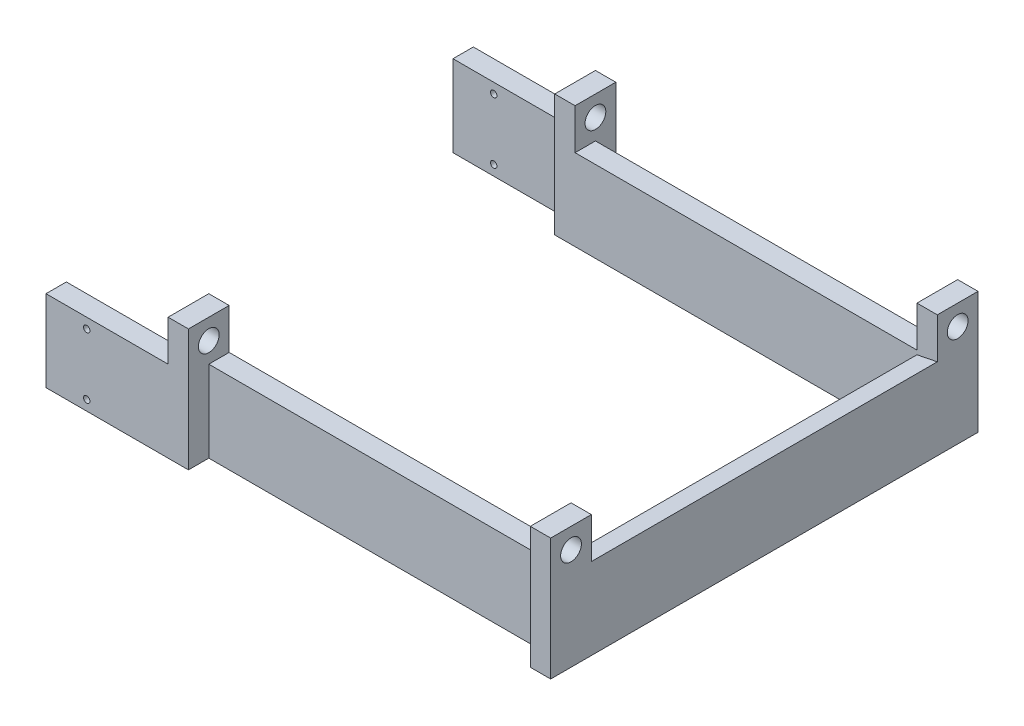
ISO-10303-21;
HEADER;
FILE_DESCRIPTION(('STEP AP214'),'2;1');
FILE_NAME('part.step','',(''),(''),'','','');
FILE_SCHEMA(('AUTOMOTIVE_DESIGN { 1 0 10303 214 1 1 1 1 }'));
ENDSEC;
DATA;
#1=APPLICATION_CONTEXT('core data for automotive mechanical design processes');
#2=APPLICATION_PROTOCOL_DEFINITION('international standard','automotive_design',2000,#1);
#3=PRODUCT_CONTEXT('',#1,'mechanical');
#4=PRODUCT('Part','Part','',(#3));
#5=PRODUCT_RELATED_PRODUCT_CATEGORY('part','',(#4));
#6=PRODUCT_DEFINITION_FORMATION('','',#4);
#7=PRODUCT_DEFINITION_CONTEXT('part definition',#1,'design');
#8=PRODUCT_DEFINITION('design','',#6,#7);
#9=PRODUCT_DEFINITION_SHAPE('','',#8);
#10=(LENGTH_UNIT() NAMED_UNIT(*) SI_UNIT(.MILLI.,.METRE.));
#11=(NAMED_UNIT(*) PLANE_ANGLE_UNIT() SI_UNIT($,.RADIAN.));
#12=(NAMED_UNIT(*) SI_UNIT($,.STERADIAN.) SOLID_ANGLE_UNIT());
#13=UNCERTAINTY_MEASURE_WITH_UNIT(LENGTH_MEASURE(1.E-05),#10,'distance_accuracy_value','');
#14=(GEOMETRIC_REPRESENTATION_CONTEXT(3) GLOBAL_UNCERTAINTY_ASSIGNED_CONTEXT((#13)) GLOBAL_UNIT_ASSIGNED_CONTEXT((#10,
#11,#12)) REPRESENTATION_CONTEXT('',''));
#15=CARTESIAN_POINT('',(0.,0.,0.));
#16=DIRECTION('',(0.,0.,1.));
#17=DIRECTION('',(1.,0.,0.));
#18=AXIS2_PLACEMENT_3D('',#15,#16,#17);
#19=CARTESIAN_POINT('',(0.,25.4,0.));
#20=DIRECTION('',(0.,1.,0.));
#21=DIRECTION('',(0.,0.,1.));
#22=AXIS2_PLACEMENT_3D('',#19,#20,#21);
#23=PLANE('',#22);
#24=DIRECTION('',(1.,0.,0.));
#25=VECTOR('',#24,1.);
#26=CARTESIAN_POINT('',(3.17499999999997,25.4,-114.3));
#27=LINE('',#26,#25);
#28=CARTESIAN_POINT('',(6.35,25.4,-114.3));
#29=VERTEX_POINT('',#28);
#30=CARTESIAN_POINT('',(113.03,25.4,-114.3));
#31=VERTEX_POINT('',#30);
#32=EDGE_CURVE('E68',#29,#31,#27,.T.);
#33=ORIENTED_EDGE('',*,*,#32,.T.);
#34=DIRECTION('',(0.,0.,-1.));
#35=VECTOR('',#34,1.);
#36=CARTESIAN_POINT('',(113.03,25.4,0.));
#37=LINE('',#36,#35);
#38=CARTESIAN_POINT('',(113.03,25.4,-120.65));
#39=VERTEX_POINT('',#38);
#40=EDGE_CURVE('E63',#31,#39,#37,.T.);
#41=ORIENTED_EDGE('',*,*,#40,.T.);
#42=DIRECTION('',(-1.,0.,0.));
#43=VECTOR('',#42,1.);
#44=CARTESIAN_POINT('',(0.,25.4,-120.65));
#45=LINE('',#44,#43);
#46=CARTESIAN_POINT('',(6.35,25.4,-120.65));
#47=VERTEX_POINT('',#46);
#48=EDGE_CURVE('E473',#39,#47,#45,.T.);
#49=ORIENTED_EDGE('',*,*,#48,.T.);
#50=DIRECTION('',(0.,0.,1.));
#51=VECTOR('',#50,1.);
#52=CARTESIAN_POINT('',(6.34999999999961,25.4,0.));
#53=LINE('',#52,#51);
#54=EDGE_CURVE('E332',#47,#29,#53,.T.);
#55=ORIENTED_EDGE('',*,*,#54,.T.);
#56=EDGE_LOOP('',(#33,#41,#49,#55));
#57=FACE_BOUND('',#56,.T.);
#58=ADVANCED_FACE('F45',(#57),#23,.T.);
#59=CARTESIAN_POINT('',(0.,25.4,-120.65));
#60=DIRECTION('',(0.,0.,1.));
#61=DIRECTION('',(1.,0.,0.));
#62=AXIS2_PLACEMENT_3D('',#59,#60,#61);
#63=PLANE('',#62);
#64=DIRECTION('',(0.,1.,0.));
#65=VECTOR('',#64,1.);
#66=CARTESIAN_POINT('',(113.03,25.4,-120.65));
#67=LINE('',#66,#65);
#68=CARTESIAN_POINT('',(113.03,0.,-120.65));
#69=VERTEX_POINT('',#68);
#70=EDGE_CURVE('E242',#69,#39,#67,.T.);
#71=ORIENTED_EDGE('',*,*,#70,.F.);
#72=DIRECTION('',(-1.,0.,0.));
#73=VECTOR('',#72,1.);
#74=CARTESIAN_POINT('',(0.,0.,-120.65));
#75=LINE('',#74,#73);
#76=CARTESIAN_POINT('',(6.35,0.,-120.65));
#77=VERTEX_POINT('',#76);
#78=EDGE_CURVE('E256',#69,#77,#75,.T.);
#79=ORIENTED_EDGE('',*,*,#78,.T.);
#80=DIRECTION('',(0.,1.,0.));
#81=VECTOR('',#80,1.);
#82=CARTESIAN_POINT('',(6.35,25.4,-120.65));
#83=LINE('',#82,#81);
#84=EDGE_CURVE('E398',#77,#47,#83,.T.);
#85=ORIENTED_EDGE('',*,*,#84,.T.);
#86=ORIENTED_EDGE('',*,*,#48,.F.);
#87=EDGE_LOOP('',(#71,#79,#85,#86));
#88=FACE_BOUND('',#87,.T.);
#89=ADVANCED_FACE('F642',(#88),#63,.F.);
#90=DIRECTION('',(-1.,0.,0.));
#91=VECTOR('',#90,1.);
#92=CARTESIAN_POINT('',(6.35,25.4,6.35));
#93=LINE('',#92,#91);
#94=CARTESIAN_POINT('',(0.,25.4,6.35));
#95=VERTEX_POINT('',#94);
#96=CARTESIAN_POINT('',(-38.1,25.4,6.35));
#97=VERTEX_POINT('',#96);
#98=EDGE_CURVE('E420',#95,#97,#93,.T.);
#99=ORIENTED_EDGE('',*,*,#98,.F.);
#100=DIRECTION('',(0.,0.,-1.));
#101=VECTOR('',#100,1.);
#102=CARTESIAN_POINT('',(0.,25.4,0.));
#103=LINE('',#102,#101);
#104=CARTESIAN_POINT('',(0.,25.4,0.));
#105=VERTEX_POINT('',#104);
#106=EDGE_CURVE('E304',#95,#105,#103,.T.);
#107=ORIENTED_EDGE('',*,*,#106,.T.);
#108=DIRECTION('',(-1.,0.,0.));
#109=VECTOR('',#108,1.);
#110=CARTESIAN_POINT('',(6.35,25.4,0.));
#111=LINE('',#110,#109);
#112=CARTESIAN_POINT('',(-38.1,25.4,0.));
#113=VERTEX_POINT('',#112);
#114=EDGE_CURVE('E434',#105,#113,#111,.T.);
#115=ORIENTED_EDGE('',*,*,#114,.T.);
#116=DIRECTION('',(0.,0.,-1.));
#117=VECTOR('',#116,1.);
#118=CARTESIAN_POINT('',(-38.1,25.4,6.35));
#119=LINE('',#118,#117);
#120=EDGE_CURVE('E450',#97,#113,#119,.T.);
#121=ORIENTED_EDGE('',*,*,#120,.F.);
#122=EDGE_LOOP('',(#99,#107,#115,#121));
#123=FACE_BOUND('',#122,.T.);
#124=ADVANCED_FACE('F644',(#123),#23,.T.);
#125=DIRECTION('',(-1.,0.,0.));
#126=VECTOR('',#125,1.);
#127=CARTESIAN_POINT('',(3.17500000000001,25.4,-6.35));
#128=LINE('',#127,#126);
#129=CARTESIAN_POINT('',(113.03,25.4,-6.35));
#130=VERTEX_POINT('',#129);
#131=CARTESIAN_POINT('',(6.34999999999998,25.4,-6.35));
#132=VERTEX_POINT('',#131);
#133=EDGE_CURVE('E479',#130,#132,#128,.T.);
#134=ORIENTED_EDGE('',*,*,#133,.T.);
#135=DIRECTION('',(0.,0.,1.));
#136=VECTOR('',#135,1.);
#137=CARTESIAN_POINT('',(6.35000000000001,25.4,0.));
#138=LINE('',#137,#136);
#139=CARTESIAN_POINT('',(6.35,25.4,0.));
#140=VERTEX_POINT('',#139);
#141=EDGE_CURVE('E307',#132,#140,#138,.T.);
#142=ORIENTED_EDGE('',*,*,#141,.T.);
#143=DIRECTION('',(1.,0.,0.));
#144=VECTOR('',#143,1.);
#145=CARTESIAN_POINT('',(0.,25.4,0.));
#146=LINE('',#145,#144);
#147=CARTESIAN_POINT('',(113.03,25.4,0.));
#148=VERTEX_POINT('',#147);
#149=EDGE_CURVE('E469',#140,#148,#146,.T.);
#150=ORIENTED_EDGE('',*,*,#149,.T.);
#151=DIRECTION('',(0.,0.,-1.));
#152=VECTOR('',#151,1.);
#153=CARTESIAN_POINT('',(113.03,25.4,0.));
#154=LINE('',#153,#152);
#155=EDGE_CURVE('E373',#148,#130,#154,.T.);
#156=ORIENTED_EDGE('',*,*,#155,.T.);
#157=EDGE_LOOP('',(#134,#142,#150,#156));
#158=FACE_BOUND('',#157,.T.);
#159=ADVANCED_FACE('F612',(#158),#23,.T.);
#160=DIRECTION('',(-1.,0.,0.));
#161=VECTOR('',#160,1.);
#162=CARTESIAN_POINT('',(0.,25.4,-120.65));
#163=LINE('',#162,#161);
#164=CARTESIAN_POINT('',(0.,25.4,-120.65));
#165=VERTEX_POINT('',#164);
#166=CARTESIAN_POINT('',(-38.1,25.4,-120.65));
#167=VERTEX_POINT('',#166);
#168=EDGE_CURVE('E402',#165,#167,#163,.T.);
#169=ORIENTED_EDGE('',*,*,#168,.F.);
#170=DIRECTION('',(0.,0.,-1.));
#171=VECTOR('',#170,1.);
#172=CARTESIAN_POINT('',(-1.16701982748805E-13,25.4,0.));
#173=LINE('',#172,#171);
#174=CARTESIAN_POINT('',(0.,25.4,-127.));
#175=VERTEX_POINT('',#174);
#176=EDGE_CURVE('E335',#165,#175,#173,.T.);
#177=ORIENTED_EDGE('',*,*,#176,.T.);
#178=DIRECTION('',(-1.,0.,0.));
#179=VECTOR('',#178,1.);
#180=CARTESIAN_POINT('',(0.,25.4,-127.));
#181=LINE('',#180,#179);
#182=CARTESIAN_POINT('',(-38.1,25.4,-127.));
#183=VERTEX_POINT('',#182);
#184=EDGE_CURVE('E388',#175,#183,#181,.T.);
#185=ORIENTED_EDGE('',*,*,#184,.T.);
#186=DIRECTION('',(0.,0.,1.));
#187=VECTOR('',#186,1.);
#188=CARTESIAN_POINT('',(-38.1,25.4,-127.));
#189=LINE('',#188,#187);
#190=EDGE_CURVE('E411',#183,#167,#189,.T.);
#191=ORIENTED_EDGE('',*,*,#190,.T.);
#192=EDGE_LOOP('',(#169,#177,#185,#191));
#193=FACE_BOUND('',#192,.T.);
#194=ADVANCED_FACE('F645',(#193),#23,.T.);
#195=CARTESIAN_POINT('',(0.,25.4,0.));
#196=DIRECTION('',(0.,0.,-1.));
#197=DIRECTION('',(-1.,0.,0.));
#198=AXIS2_PLACEMENT_3D('',#195,#196,#197);
#199=PLANE('',#198);
#200=DIRECTION('',(0.,-1.,0.));
#201=VECTOR('',#200,1.);
#202=CARTESIAN_POINT('',(113.03,25.4,0.));
#203=LINE('',#202,#201);
#204=CARTESIAN_POINT('',(113.03,0.,0.));
#205=VERTEX_POINT('',#204);
#206=EDGE_CURVE('E377',#148,#205,#203,.T.);
#207=ORIENTED_EDGE('',*,*,#206,.F.);
#208=ORIENTED_EDGE('',*,*,#149,.F.);
#209=DIRECTION('',(0.,1.,0.));
#210=VECTOR('',#209,1.);
#211=CARTESIAN_POINT('',(6.35,25.4,0.));
#212=LINE('',#211,#210);
#213=CARTESIAN_POINT('',(6.35,0.,0.));
#214=VERTEX_POINT('',#213);
#215=EDGE_CURVE('E410',#214,#140,#212,.T.);
#216=ORIENTED_EDGE('',*,*,#215,.F.);
#217=DIRECTION('',(1.,0.,0.));
#218=VECTOR('',#217,1.);
#219=CARTESIAN_POINT('',(0.,0.,0.));
#220=LINE('',#219,#218);
#221=EDGE_CURVE('E485',#214,#205,#220,.T.);
#222=ORIENTED_EDGE('',*,*,#221,.T.);
#223=EDGE_LOOP('',(#207,#208,#216,#222));
#224=FACE_BOUND('',#223,.T.);
#225=ADVANCED_FACE('F615',(#224),#199,.F.);
#226=CARTESIAN_POINT('',(0.,25.4,0.));
#227=DIRECTION('',(1.,0.,0.));
#228=DIRECTION('',(0.,0.,-1.));
#229=AXIS2_PLACEMENT_3D('',#226,#227,#228);
#230=PLANE('',#229);
#231=CARTESIAN_POINT('',(0.,31.75,0.));
#232=DIRECTION('',(1.,0.,0.));
#233=DIRECTION('',(0.,0.,-1.));
#234=AXIS2_PLACEMENT_3D('',#231,#232,#233);
#235=CIRCLE('',#234,3.2385);
#236=CARTESIAN_POINT('',(0.,31.75,-3.23849999999999));
#237=VERTEX_POINT('',#236);
#238=EDGE_CURVE('E562',#237,#237,#235,.T.);
#239=ORIENTED_EDGE('',*,*,#238,.T.);
#240=EDGE_LOOP('',(#239));
#241=FACE_BOUND('',#240,.T.);
#242=DIRECTION('',(0.,0.,1.));
#243=VECTOR('',#242,1.);
#244=CARTESIAN_POINT('',(0.,0.,0.));
#245=LINE('',#244,#243);
#246=CARTESIAN_POINT('',(0.,0.,-6.35));
#247=VERTEX_POINT('',#246);
#248=CARTESIAN_POINT('',(0.,0.,0.));
#249=VERTEX_POINT('',#248);
#250=EDGE_CURVE('E468',#247,#249,#245,.T.);
#251=ORIENTED_EDGE('',*,*,#250,.T.);
#252=DIRECTION('',(0.,-1.,0.));
#253=VECTOR('',#252,1.);
#254=CARTESIAN_POINT('',(0.,25.4,0.));
#255=LINE('',#254,#253);
#256=EDGE_CURVE('E11',#105,#249,#255,.T.);
#257=ORIENTED_EDGE('',*,*,#256,.F.);
#258=ORIENTED_EDGE('',*,*,#106,.F.);
#259=DIRECTION('',(0.,-1.,0.));
#260=VECTOR('',#259,1.);
#261=CARTESIAN_POINT('',(0.,38.1,6.35000000000002));
#262=LINE('',#261,#260);
#263=CARTESIAN_POINT('',(0.,38.1,6.35000000000002));
#264=VERTEX_POINT('',#263);
#265=EDGE_CURVE('E282',#264,#95,#262,.T.);
#266=ORIENTED_EDGE('',*,*,#265,.F.);
#267=DIRECTION('',(0.,0.,1.));
#268=VECTOR('',#267,1.);
#269=CARTESIAN_POINT('',(0.,38.1,0.));
#270=LINE('',#269,#268);
#271=CARTESIAN_POINT('',(0.,38.1,-6.35));
#272=VERTEX_POINT('',#271);
#273=EDGE_CURVE('E300',#272,#264,#270,.T.);
#274=ORIENTED_EDGE('',*,*,#273,.F.);
#275=DIRECTION('',(0.,-1.,0.));
#276=VECTOR('',#275,1.);
#277=CARTESIAN_POINT('',(0.,25.4,-6.35));
#278=LINE('',#277,#276);
#279=EDGE_CURVE('E482',#272,#247,#278,.T.);
#280=ORIENTED_EDGE('',*,*,#279,.T.);
#281=EDGE_LOOP('',(#251,#257,#258,#266,#274,#280));
#282=FACE_BOUND('',#281,.T.);
#283=ADVANCED_FACE('F47',(#241,#282),#230,.F.);
#284=CARTESIAN_POINT('',(119.38,25.4,0.));
#285=DIRECTION('',(-1.,0.,0.));
#286=DIRECTION('',(0.,0.,1.));
#287=AXIS2_PLACEMENT_3D('',#284,#285,#286);
#288=PLANE('',#287);
#289=CARTESIAN_POINT('',(119.38,31.75,0.));
#290=DIRECTION('',(-1.,0.,0.));
#291=DIRECTION('',(0.,0.,1.));
#292=AXIS2_PLACEMENT_3D('',#289,#290,#291);
#293=CIRCLE('',#292,3.2385);
#294=CARTESIAN_POINT('',(119.38,31.75,3.2385));
#295=VERTEX_POINT('',#294);
#296=EDGE_CURVE('E558',#295,#295,#293,.T.);
#297=ORIENTED_EDGE('',*,*,#296,.T.);
#298=EDGE_LOOP('',(#297));
#299=FACE_BOUND('',#298,.T.);
#300=CARTESIAN_POINT('',(119.38,31.75,-120.65));
#301=DIRECTION('',(-1.,0.,0.));
#302=DIRECTION('',(0.,0.,1.));
#303=AXIS2_PLACEMENT_3D('',#300,#301,#302);
#304=CIRCLE('',#303,3.23850000000001);
#305=CARTESIAN_POINT('',(119.38,31.75,-117.4115));
#306=VERTEX_POINT('',#305);
#307=EDGE_CURVE('E550',#306,#306,#304,.T.);
#308=ORIENTED_EDGE('',*,*,#307,.T.);
#309=EDGE_LOOP('',(#308));
#310=FACE_BOUND('',#309,.T.);
#311=DIRECTION('',(0.,-1.,0.));
#312=VECTOR('',#311,1.);
#313=CARTESIAN_POINT('',(119.38,38.1,-114.3));
#314=LINE('',#313,#312);
#315=CARTESIAN_POINT('',(119.38,38.1,-114.3));
#316=VERTEX_POINT('',#315);
#317=CARTESIAN_POINT('',(119.38,25.4,-114.3));
#318=VERTEX_POINT('',#317);
#319=EDGE_CURVE('E268',#316,#318,#314,.T.);
#320=ORIENTED_EDGE('',*,*,#319,.T.);
#321=DIRECTION('',(0.,0.,1.));
#322=VECTOR('',#321,1.);
#323=CARTESIAN_POINT('',(119.38,25.4,-120.775754782263));
#324=LINE('',#323,#322);
#325=CARTESIAN_POINT('',(119.38,25.4,-6.35000000000001));
#326=VERTEX_POINT('',#325);
#327=EDGE_CURVE('E462',#318,#326,#324,.T.);
#328=ORIENTED_EDGE('',*,*,#327,.T.);
#329=DIRECTION('',(0.,-1.,0.));
#330=VECTOR('',#329,1.);
#331=CARTESIAN_POINT('',(119.38,38.1,-6.35000000000001));
#332=LINE('',#331,#330);
#333=CARTESIAN_POINT('',(119.38,38.1,-6.35000000000001));
#334=VERTEX_POINT('',#333);
#335=EDGE_CURVE('E370',#334,#326,#332,.T.);
#336=ORIENTED_EDGE('',*,*,#335,.F.);
#337=DIRECTION('',(0.,0.,-1.));
#338=VECTOR('',#337,1.);
#339=CARTESIAN_POINT('',(119.38,38.1,-1.30451205393456E-13));
#340=LINE('',#339,#338);
#341=CARTESIAN_POINT('',(119.38,38.1,6.34999999999999));
#342=VERTEX_POINT('',#341);
#343=EDGE_CURVE('E340',#342,#334,#340,.T.);
#344=ORIENTED_EDGE('',*,*,#343,.F.);
#345=DIRECTION('',(0.,-1.,0.));
#346=VECTOR('',#345,1.);
#347=CARTESIAN_POINT('',(119.38,38.1,6.34999999999999));
#348=LINE('',#347,#346);
#349=CARTESIAN_POINT('',(119.38,0.,6.34999999999999));
#350=VERTEX_POINT('',#349);
#351=EDGE_CURVE('E354',#342,#350,#348,.T.);
#352=ORIENTED_EDGE('',*,*,#351,.T.);
#353=DIRECTION('',(0.,0.,-1.));
#354=VECTOR('',#353,1.);
#355=CARTESIAN_POINT('',(119.38,0.,0.));
#356=LINE('',#355,#354);
#357=CARTESIAN_POINT('',(119.38,0.,-127.));
#358=VERTEX_POINT('',#357);
#359=EDGE_CURVE('E489',#350,#358,#356,.T.);
#360=ORIENTED_EDGE('',*,*,#359,.T.);
#361=DIRECTION('',(0.,-1.,0.));
#362=VECTOR('',#361,1.);
#363=CARTESIAN_POINT('',(119.38,38.1,-127.));
#364=LINE('',#363,#362);
#365=CARTESIAN_POINT('',(119.38,38.1,-127.));
#366=VERTEX_POINT('',#365);
#367=EDGE_CURVE('E238',#366,#358,#364,.T.);
#368=ORIENTED_EDGE('',*,*,#367,.F.);
#369=DIRECTION('',(0.,0.,-1.));
#370=VECTOR('',#369,1.);
#371=CARTESIAN_POINT('',(119.38,38.1,1.30451205393455E-13));
#372=LINE('',#371,#370);
#373=EDGE_CURVE('E259',#316,#366,#372,.T.);
#374=ORIENTED_EDGE('',*,*,#373,.F.);
#375=EDGE_LOOP('',(#320,#328,#336,#344,#352,#360,#368,#374));
#376=FACE_BOUND('',#375,.T.);
#377=ADVANCED_FACE('F576',(#299,#310,#376),#288,.F.);
#378=CARTESIAN_POINT('',(0.,25.4,-114.3));
#379=DIRECTION('',(1.,0.,0.));
#380=DIRECTION('',(0.,0.,-1.));
#381=AXIS2_PLACEMENT_3D('',#378,#379,#380);
#382=PLANE('',#381);
#383=CARTESIAN_POINT('',(0.,31.75,-120.65));
#384=DIRECTION('',(1.,0.,0.));
#385=DIRECTION('',(0.,0.,-1.));
#386=AXIS2_PLACEMENT_3D('',#383,#384,#385);
#387=CIRCLE('',#386,3.23850000000001);
#388=CARTESIAN_POINT('',(0.,31.75,-123.8885));
#389=VERTEX_POINT('',#388);
#390=EDGE_CURVE('E532',#389,#389,#387,.T.);
#391=ORIENTED_EDGE('',*,*,#390,.T.);
#392=EDGE_LOOP('',(#391));
#393=FACE_BOUND('',#392,.T.);
#394=DIRECTION('',(0.,0.,1.));
#395=VECTOR('',#394,1.);
#396=CARTESIAN_POINT('',(0.,0.,-114.3));
#397=LINE('',#396,#395);
#398=CARTESIAN_POINT('',(0.,0.,-120.65));
#399=VERTEX_POINT('',#398);
#400=CARTESIAN_POINT('',(0.,0.,-114.3));
#401=VERTEX_POINT('',#400);
#402=EDGE_CURVE('E494',#399,#401,#397,.T.);
#403=ORIENTED_EDGE('',*,*,#402,.T.);
#404=DIRECTION('',(0.,-1.,0.));
#405=VECTOR('',#404,1.);
#406=CARTESIAN_POINT('',(0.,25.4,-114.3));
#407=LINE('',#406,#405);
#408=CARTESIAN_POINT('',(0.,38.1,-114.3));
#409=VERTEX_POINT('',#408);
#410=EDGE_CURVE('E517',#409,#401,#407,.T.);
#411=ORIENTED_EDGE('',*,*,#410,.F.);
#412=DIRECTION('',(0.,0.,1.));
#413=VECTOR('',#412,1.);
#414=CARTESIAN_POINT('',(-1.16701982748805E-13,38.1,0.));
#415=LINE('',#414,#413);
#416=CARTESIAN_POINT('',(0.,38.1,-127.));
#417=VERTEX_POINT('',#416);
#418=EDGE_CURVE('E328',#417,#409,#415,.T.);
#419=ORIENTED_EDGE('',*,*,#418,.F.);
#420=DIRECTION('',(0.,-1.,0.));
#421=VECTOR('',#420,1.);
#422=CARTESIAN_POINT('',(0.,38.1,-127.));
#423=LINE('',#422,#421);
#424=EDGE_CURVE('E314',#417,#175,#423,.T.);
#425=ORIENTED_EDGE('',*,*,#424,.T.);
#426=ORIENTED_EDGE('',*,*,#176,.F.);
#427=DIRECTION('',(0.,-1.,0.));
#428=VECTOR('',#427,1.);
#429=CARTESIAN_POINT('',(0.,25.4,-120.65));
#430=LINE('',#429,#428);
#431=EDGE_CURVE('E55',#165,#399,#430,.T.);
#432=ORIENTED_EDGE('',*,*,#431,.T.);
#433=EDGE_LOOP('',(#403,#411,#419,#425,#426,#432));
#434=FACE_BOUND('',#433,.T.);
#435=ADVANCED_FACE('F667',(#393,#434),#382,.F.);
#436=CARTESIAN_POINT('',(3.17499999999997,25.4,-114.3));
#437=DIRECTION('',(0.,0.,-1.));
#438=DIRECTION('',(-1.,0.,0.));
#439=AXIS2_PLACEMENT_3D('',#436,#437,#438);
#440=PLANE('',#439);
#441=DIRECTION('',(0.98058067569092,0.196116135138184,0.));
#442=VECTOR('',#441,1.);
#443=CARTESIAN_POINT('',(7.6444230769231,3.05288461538459,-114.3));
#444=LINE('',#443,#442);
#445=CARTESIAN_POINT('',(113.03,24.13,-114.3));
#446=VERTEX_POINT('',#445);
#447=EDGE_CURVE('E459',#446,#318,#444,.T.);
#448=ORIENTED_EDGE('',*,*,#447,.T.);
#449=ORIENTED_EDGE('',*,*,#319,.F.);
#450=DIRECTION('',(1.,0.,0.));
#451=VECTOR('',#450,1.);
#452=CARTESIAN_POINT('',(0.,38.1,-114.3));
#453=LINE('',#452,#451);
#454=CARTESIAN_POINT('',(113.03,38.1,-114.3));
#455=VERTEX_POINT('',#454);
#456=EDGE_CURVE('E271',#455,#316,#453,.T.);
#457=ORIENTED_EDGE('',*,*,#456,.F.);
#458=DIRECTION('',(0.,-1.,0.));
#459=VECTOR('',#458,1.);
#460=CARTESIAN_POINT('',(113.03,38.1,-114.3));
#461=LINE('',#460,#459);
#462=EDGE_CURVE('E252',#455,#31,#461,.T.);
#463=ORIENTED_EDGE('',*,*,#462,.T.);
#464=ORIENTED_EDGE('',*,*,#32,.F.);
#465=DIRECTION('',(0.,-1.,0.));
#466=VECTOR('',#465,1.);
#467=CARTESIAN_POINT('',(6.34999999999998,38.1,-114.3));
#468=LINE('',#467,#466);
#469=CARTESIAN_POINT('',(6.34999999999998,38.1,-114.3));
#470=VERTEX_POINT('',#469);
#471=EDGE_CURVE('E310',#470,#29,#468,.T.);
#472=ORIENTED_EDGE('',*,*,#471,.F.);
#473=DIRECTION('',(1.,0.,0.));
#474=VECTOR('',#473,1.);
#475=CARTESIAN_POINT('',(0.,38.1,-114.3));
#476=LINE('',#475,#474);
#477=EDGE_CURVE('E325',#409,#470,#476,.T.);
#478=ORIENTED_EDGE('',*,*,#477,.F.);
#479=ORIENTED_EDGE('',*,*,#410,.T.);
#480=DIRECTION('',(1.,0.,0.));
#481=VECTOR('',#480,1.);
#482=CARTESIAN_POINT('',(3.17499999999997,0.,-114.3));
#483=LINE('',#482,#481);
#484=CARTESIAN_POINT('',(113.03,0.,-114.3));
#485=VERTEX_POINT('',#484);
#486=EDGE_CURVE('E498',#401,#485,#483,.T.);
#487=ORIENTED_EDGE('',*,*,#486,.T.);
#488=DIRECTION('',(0.,-1.,0.));
#489=VECTOR('',#488,1.);
#490=CARTESIAN_POINT('',(113.03,25.4,-114.3));
#491=LINE('',#490,#489);
#492=EDGE_CURVE('E513',#446,#485,#491,.T.);
#493=ORIENTED_EDGE('',*,*,#492,.F.);
#494=EDGE_LOOP('',(#448,#449,#457,#463,#464,#472,#478,#479,#487,#493));
#495=FACE_BOUND('',#494,.T.);
#496=ADVANCED_FACE('F579',(#495),#440,.F.);
#497=CARTESIAN_POINT('',(113.03,25.4,-114.3));
#498=DIRECTION('',(1.,0.,0.));
#499=DIRECTION('',(0.,0.,-1.));
#500=AXIS2_PLACEMENT_3D('',#497,#498,#499);
#501=PLANE('',#500);
#502=DIRECTION('',(0.,-1.,0.));
#503=VECTOR('',#502,1.);
#504=CARTESIAN_POINT('',(113.03,25.4,-6.35));
#505=LINE('',#504,#503);
#506=CARTESIAN_POINT('',(113.03,24.13,-6.35));
#507=VERTEX_POINT('',#506);
#508=CARTESIAN_POINT('',(113.03,0.,-6.35));
#509=VERTEX_POINT('',#508);
#510=EDGE_CURVE('E510',#507,#509,#505,.T.);
#511=ORIENTED_EDGE('',*,*,#510,.F.);
#512=DIRECTION('',(0.,0.,1.));
#513=VECTOR('',#512,1.);
#514=CARTESIAN_POINT('',(113.03,24.13,-120.775754782263));
#515=LINE('',#514,#513);
#516=EDGE_CURVE('E458',#446,#507,#515,.T.);
#517=ORIENTED_EDGE('',*,*,#516,.F.);
#518=ORIENTED_EDGE('',*,*,#492,.T.);
#519=DIRECTION('',(0.,0.,1.));
#520=VECTOR('',#519,1.);
#521=CARTESIAN_POINT('',(113.03,0.,-114.3));
#522=LINE('',#521,#520);
#523=EDGE_CURVE('E501',#485,#509,#522,.T.);
#524=ORIENTED_EDGE('',*,*,#523,.T.);
#525=EDGE_LOOP('',(#511,#517,#518,#524));
#526=FACE_BOUND('',#525,.T.);
#527=ADVANCED_FACE('F590',(#526),#501,.F.);
#528=CARTESIAN_POINT('',(3.17500000000001,25.4,-6.35));
#529=DIRECTION('',(0.,0.,1.));
#530=DIRECTION('',(1.,0.,0.));
#531=AXIS2_PLACEMENT_3D('',#528,#529,#530);
#532=PLANE('',#531);
#533=ORIENTED_EDGE('',*,*,#279,.F.);
#534=DIRECTION('',(-1.,0.,0.));
#535=VECTOR('',#534,1.);
#536=CARTESIAN_POINT('',(0.,38.1,-6.35));
#537=LINE('',#536,#535);
#538=CARTESIAN_POINT('',(6.34999999999998,38.1,-6.35));
#539=VERTEX_POINT('',#538);
#540=EDGE_CURVE('E290',#539,#272,#537,.T.);
#541=ORIENTED_EDGE('',*,*,#540,.F.);
#542=DIRECTION('',(0.,-1.,0.));
#543=VECTOR('',#542,1.);
#544=CARTESIAN_POINT('',(6.34999999999998,38.1,-6.35));
#545=LINE('',#544,#543);
#546=EDGE_CURVE('E286',#539,#132,#545,.T.);
#547=ORIENTED_EDGE('',*,*,#546,.T.);
#548=ORIENTED_EDGE('',*,*,#133,.F.);
#549=DIRECTION('',(0.,-1.,0.));
#550=VECTOR('',#549,1.);
#551=CARTESIAN_POINT('',(113.03,38.1,-6.35));
#552=LINE('',#551,#550);
#553=CARTESIAN_POINT('',(113.03,38.1,-6.35));
#554=VERTEX_POINT('',#553);
#555=EDGE_CURVE('E367',#554,#130,#552,.T.);
#556=ORIENTED_EDGE('',*,*,#555,.F.);
#557=DIRECTION('',(-1.,0.,0.));
#558=VECTOR('',#557,1.);
#559=CARTESIAN_POINT('',(0.,38.1,-6.34999999999985));
#560=LINE('',#559,#558);
#561=EDGE_CURVE('E344',#334,#554,#560,.T.);
#562=ORIENTED_EDGE('',*,*,#561,.F.);
#563=ORIENTED_EDGE('',*,*,#335,.T.);
#564=DIRECTION('',(0.98058067569092,0.196116135138184,0.));
#565=VECTOR('',#564,1.);
#566=CARTESIAN_POINT('',(7.6444230769231,3.05288461538459,-6.35));
#567=LINE('',#566,#565);
#568=EDGE_CURVE('E454',#507,#326,#567,.T.);
#569=ORIENTED_EDGE('',*,*,#568,.F.);
#570=ORIENTED_EDGE('',*,*,#510,.T.);
#571=DIRECTION('',(-1.,0.,0.));
#572=VECTOR('',#571,1.);
#573=CARTESIAN_POINT('',(3.17500000000001,0.,-6.35));
#574=LINE('',#573,#572);
#575=EDGE_CURVE('E474',#509,#247,#574,.T.);
#576=ORIENTED_EDGE('',*,*,#575,.T.);
#577=EDGE_LOOP('',(#533,#541,#547,#548,#556,#562,#563,#569,#570,#576));
#578=FACE_BOUND('',#577,.T.);
#579=ADVANCED_FACE('F587',(#578),#532,.F.);
#580=CARTESIAN_POINT('',(0.,0.,0.));
#581=DIRECTION('',(0.,1.,0.));
#582=DIRECTION('',(0.,0.,1.));
#583=AXIS2_PLACEMENT_3D('',#580,#581,#582);
#584=PLANE('',#583);
#585=DIRECTION('',(-1.,0.,0.));
#586=VECTOR('',#585,1.);
#587=CARTESIAN_POINT('',(-5.55111512312574E-13,0.,-126.999999999999));
#588=LINE('',#587,#586);
#589=CARTESIAN_POINT('',(113.03,0.,-127.));
#590=VERTEX_POINT('',#589);
#591=EDGE_CURVE('E232',#358,#590,#588,.T.);
#592=ORIENTED_EDGE('',*,*,#591,.F.);
#593=ORIENTED_EDGE('',*,*,#359,.F.);
#594=DIRECTION('',(1.,0.,0.));
#595=VECTOR('',#594,1.);
#596=CARTESIAN_POINT('',(0.,0.,6.35000000000001));
#597=LINE('',#596,#595);
#598=CARTESIAN_POINT('',(113.03,0.,6.34999999999999));
#599=VERTEX_POINT('',#598);
#600=EDGE_CURVE('E345',#599,#350,#597,.T.);
#601=ORIENTED_EDGE('',*,*,#600,.F.);
#602=DIRECTION('',(0.,0.,1.));
#603=VECTOR('',#602,1.);
#604=CARTESIAN_POINT('',(113.03,0.,0.));
#605=LINE('',#604,#603);
#606=EDGE_CURVE('E339',#205,#599,#605,.T.);
#607=ORIENTED_EDGE('',*,*,#606,.F.);
#608=ORIENTED_EDGE('',*,*,#221,.F.);
#609=DIRECTION('',(0.,0.,-1.));
#610=VECTOR('',#609,1.);
#611=CARTESIAN_POINT('',(6.35,0.,6.35));
#612=LINE('',#611,#610);
#613=CARTESIAN_POINT('',(6.35,0.,6.35));
#614=VERTEX_POINT('',#613);
#615=EDGE_CURVE('E430',#614,#214,#612,.T.);
#616=ORIENTED_EDGE('',*,*,#615,.F.);
#617=DIRECTION('',(1.,0.,0.));
#618=VECTOR('',#617,1.);
#619=CARTESIAN_POINT('',(6.35,0.,6.35));
#620=LINE('',#619,#618);
#621=CARTESIAN_POINT('',(-38.1,0.,6.35));
#622=VERTEX_POINT('',#621);
#623=EDGE_CURVE('E427',#622,#614,#620,.T.);
#624=ORIENTED_EDGE('',*,*,#623,.F.);
#625=DIRECTION('',(0.,0.,-1.));
#626=VECTOR('',#625,1.);
#627=CARTESIAN_POINT('',(-38.1,0.,6.35));
#628=LINE('',#627,#626);
#629=CARTESIAN_POINT('',(-38.1,0.,0.));
#630=VERTEX_POINT('',#629);
#631=EDGE_CURVE('E446',#622,#630,#628,.T.);
#632=ORIENTED_EDGE('',*,*,#631,.T.);
#633=DIRECTION('',(1.,0.,0.));
#634=VECTOR('',#633,1.);
#635=CARTESIAN_POINT('',(6.35,0.,0.));
#636=LINE('',#635,#634);
#637=EDGE_CURVE('E421',#630,#249,#636,.T.);
#638=ORIENTED_EDGE('',*,*,#637,.T.);
#639=ORIENTED_EDGE('',*,*,#250,.F.);
#640=ORIENTED_EDGE('',*,*,#575,.F.);
#641=ORIENTED_EDGE('',*,*,#523,.F.);
#642=ORIENTED_EDGE('',*,*,#486,.F.);
#643=ORIENTED_EDGE('',*,*,#402,.F.);
#644=DIRECTION('',(1.,0.,0.));
#645=VECTOR('',#644,1.);
#646=CARTESIAN_POINT('',(0.,0.,-120.65));
#647=LINE('',#646,#645);
#648=CARTESIAN_POINT('',(-38.1,0.,-120.65));
#649=VERTEX_POINT('',#648);
#650=EDGE_CURVE('E380',#649,#399,#647,.T.);
#651=ORIENTED_EDGE('',*,*,#650,.F.);
#652=DIRECTION('',(0.,0.,1.));
#653=VECTOR('',#652,1.);
#654=CARTESIAN_POINT('',(-38.1,0.,-127.));
#655=LINE('',#654,#653);
#656=CARTESIAN_POINT('',(-38.1,0.,-127.));
#657=VERTEX_POINT('',#656);
#658=EDGE_CURVE('E408',#657,#649,#655,.T.);
#659=ORIENTED_EDGE('',*,*,#658,.F.);
#660=DIRECTION('',(1.,0.,0.));
#661=VECTOR('',#660,1.);
#662=CARTESIAN_POINT('',(0.,0.,-127.));
#663=LINE('',#662,#661);
#664=CARTESIAN_POINT('',(6.35,0.,-127.));
#665=VERTEX_POINT('',#664);
#666=EDGE_CURVE('E381',#657,#665,#663,.T.);
#667=ORIENTED_EDGE('',*,*,#666,.T.);
#668=DIRECTION('',(0.,0.,1.));
#669=VECTOR('',#668,1.);
#670=CARTESIAN_POINT('',(6.35,0.,-127.));
#671=LINE('',#670,#669);
#672=EDGE_CURVE('E395',#665,#77,#671,.T.);
#673=ORIENTED_EDGE('',*,*,#672,.T.);
#674=ORIENTED_EDGE('',*,*,#78,.F.);
#675=DIRECTION('',(0.,0.,1.));
#676=VECTOR('',#675,1.);
#677=CARTESIAN_POINT('',(113.03,0.,0.));
#678=LINE('',#677,#676);
#679=EDGE_CURVE('E243',#590,#69,#678,.T.);
#680=ORIENTED_EDGE('',*,*,#679,.F.);
#681=EDGE_LOOP('',(#592,#593,#601,#607,#608,#616,#624,#632,#638,#639,#640,#641,#642,#643,#651,
#659,#667,#673,#674,#680));
#682=FACE_BOUND('',#681,.T.);
#683=ADVANCED_FACE('F254',(#682),#584,.F.);
#684=CARTESIAN_POINT('',(7.6444230769231,3.05288461538459,-120.775754782263));
#685=DIRECTION('',(0.196116135138184,-0.98058067569092,0.));
#686=DIRECTION('',(0.98058067569092,0.196116135138184,0.));
#687=AXIS2_PLACEMENT_3D('',#684,#685,#686);
#688=PLANE('',#687);
#689=ORIENTED_EDGE('',*,*,#516,.T.);
#690=ORIENTED_EDGE('',*,*,#568,.T.);
#691=ORIENTED_EDGE('',*,*,#327,.F.);
#692=ORIENTED_EDGE('',*,*,#447,.F.);
#693=EDGE_LOOP('',(#689,#690,#691,#692));
#694=FACE_BOUND('',#693,.T.);
#695=ADVANCED_FACE('F583',(#694),#688,.F.);
#696=CARTESIAN_POINT('',(6.35,25.4,6.35));
#697=DIRECTION('',(-1.,0.,0.));
#698=DIRECTION('',(0.,-1.,0.));
#699=AXIS2_PLACEMENT_3D('',#696,#697,#698);
#700=PLANE('',#699);
#701=CARTESIAN_POINT('',(6.35,31.75,0.));
#702=DIRECTION('',(-1.,0.,0.));
#703=DIRECTION('',(0.,-1.,0.));
#704=AXIS2_PLACEMENT_3D('',#701,#702,#703);
#705=CIRCLE('',#704,3.2385);
#706=CARTESIAN_POINT('',(6.35,28.5115,0.));
#707=VERTEX_POINT('',#706);
#708=EDGE_CURVE('E554',#707,#707,#705,.T.);
#709=ORIENTED_EDGE('',*,*,#708,.T.);
#710=EDGE_LOOP('',(#709));
#711=FACE_BOUND('',#710,.T.);
#712=ORIENTED_EDGE('',*,*,#215,.T.);
#713=ORIENTED_EDGE('',*,*,#141,.F.);
#714=ORIENTED_EDGE('',*,*,#546,.F.);
#715=DIRECTION('',(0.,0.,-1.));
#716=VECTOR('',#715,1.);
#717=CARTESIAN_POINT('',(6.35000000000001,38.1,0.));
#718=LINE('',#717,#716);
#719=CARTESIAN_POINT('',(6.35000000000004,38.1,6.35000000000001));
#720=VERTEX_POINT('',#719);
#721=EDGE_CURVE('E294',#720,#539,#718,.T.);
#722=ORIENTED_EDGE('',*,*,#721,.F.);
#723=DIRECTION('',(0.,1.,0.));
#724=VECTOR('',#723,1.);
#725=CARTESIAN_POINT('',(6.35,25.4,6.35));
#726=LINE('',#725,#724);
#727=EDGE_CURVE('E417',#614,#720,#726,.T.);
#728=ORIENTED_EDGE('',*,*,#727,.F.);
#729=ORIENTED_EDGE('',*,*,#615,.T.);
#730=EDGE_LOOP('',(#712,#713,#714,#722,#728,#729));
#731=FACE_BOUND('',#730,.T.);
#732=ADVANCED_FACE('F608',(#711,#731),#700,.F.);
#733=CARTESIAN_POINT('',(-38.1,25.4,6.35));
#734=DIRECTION('',(1.,0.,0.));
#735=DIRECTION('',(0.,1.,0.));
#736=AXIS2_PLACEMENT_3D('',#733,#734,#735);
#737=PLANE('',#736);
#738=DIRECTION('',(0.,-1.,0.));
#739=VECTOR('',#738,1.);
#740=CARTESIAN_POINT('',(-38.1,25.4,0.));
#741=LINE('',#740,#739);
#742=EDGE_CURVE('E437',#113,#630,#741,.T.);
#743=ORIENTED_EDGE('',*,*,#742,.T.);
#744=ORIENTED_EDGE('',*,*,#631,.F.);
#745=DIRECTION('',(0.,-1.,0.));
#746=VECTOR('',#745,1.);
#747=CARTESIAN_POINT('',(-38.1,25.4,6.35));
#748=LINE('',#747,#746);
#749=EDGE_CURVE('E424',#97,#622,#748,.T.);
#750=ORIENTED_EDGE('',*,*,#749,.F.);
#751=ORIENTED_EDGE('',*,*,#120,.T.);
#752=EDGE_LOOP('',(#743,#744,#750,#751));
#753=FACE_BOUND('',#752,.T.);
#754=ADVANCED_FACE('F705',(#753),#737,.F.);
#755=CARTESIAN_POINT('',(0.,0.,6.35));
#756=DIRECTION('',(0.,0.,-1.));
#757=DIRECTION('',(-1.,0.,0.));
#758=AXIS2_PLACEMENT_3D('',#755,#756,#757);
#759=PLANE('',#758);
#760=CARTESIAN_POINT('',(-25.4,22.225,6.35));
#761=DIRECTION('',(0.,0.,1.));
#762=DIRECTION('',(1.,0.,0.));
#763=AXIS2_PLACEMENT_3D('',#760,#761,#762);
#764=CIRCLE('',#763,1.000000032);
#765=CARTESIAN_POINT('',(-24.399999968,22.225,6.35));
#766=VERTEX_POINT('',#765);
#767=EDGE_CURVE('E791',#766,#766,#764,.T.);
#768=ORIENTED_EDGE('',*,*,#767,.F.);
#769=EDGE_LOOP('',(#768));
#770=FACE_BOUND('',#769,.T.);
#771=CARTESIAN_POINT('',(-25.4,3.175,6.35));
#772=DIRECTION('',(0.,0.,1.));
#773=DIRECTION('',(1.,0.,0.));
#774=AXIS2_PLACEMENT_3D('',#771,#772,#773);
#775=CIRCLE('',#774,1.000000032);
#776=CARTESIAN_POINT('',(-24.399999968,3.175,6.35));
#777=VERTEX_POINT('',#776);
#778=EDGE_CURVE('E794',#777,#777,#775,.T.);
#779=ORIENTED_EDGE('',*,*,#778,.F.);
#780=EDGE_LOOP('',(#779));
#781=FACE_BOUND('',#780,.T.);
#782=ORIENTED_EDGE('',*,*,#727,.T.);
#783=DIRECTION('',(1.,0.,0.));
#784=VECTOR('',#783,1.);
#785=CARTESIAN_POINT('',(0.,38.1,6.35000000000002));
#786=LINE('',#785,#784);
#787=EDGE_CURVE('E296',#264,#720,#786,.T.);
#788=ORIENTED_EDGE('',*,*,#787,.F.);
#789=ORIENTED_EDGE('',*,*,#265,.T.);
#790=ORIENTED_EDGE('',*,*,#98,.T.);
#791=ORIENTED_EDGE('',*,*,#749,.T.);
#792=ORIENTED_EDGE('',*,*,#623,.T.);
#793=EDGE_LOOP('',(#782,#788,#789,#790,#791,#792));
#794=FACE_BOUND('',#793,.T.);
#795=ADVANCED_FACE('F701',(#770,#781,#794),#759,.F.);
#796=CARTESIAN_POINT('',(0.,0.,0.));
#797=DIRECTION('',(0.,0.,-1.));
#798=DIRECTION('',(-1.,0.,0.));
#799=AXIS2_PLACEMENT_3D('',#796,#797,#798);
#800=PLANE('',#799);
#801=CARTESIAN_POINT('',(-25.4,22.225,0.));
#802=DIRECTION('',(0.,0.,-1.));
#803=DIRECTION('',(-1.,0.,0.));
#804=AXIS2_PLACEMENT_3D('',#801,#802,#803);
#805=CIRCLE('',#804,1.000000032);
#806=CARTESIAN_POINT('',(-26.400000032,22.225,0.));
#807=VERTEX_POINT('',#806);
#808=EDGE_CURVE('E527',#807,#807,#805,.T.);
#809=ORIENTED_EDGE('',*,*,#808,.F.);
#810=EDGE_LOOP('',(#809));
#811=FACE_BOUND('',#810,.T.);
#812=CARTESIAN_POINT('',(-25.4,3.175,0.));
#813=DIRECTION('',(0.,0.,-1.));
#814=DIRECTION('',(-1.,0.,0.));
#815=AXIS2_PLACEMENT_3D('',#812,#813,#814);
#816=CIRCLE('',#815,1.000000032);
#817=CARTESIAN_POINT('',(-26.400000032,3.175,0.));
#818=VERTEX_POINT('',#817);
#819=EDGE_CURVE('E543',#818,#818,#816,.T.);
#820=ORIENTED_EDGE('',*,*,#819,.F.);
#821=EDGE_LOOP('',(#820));
#822=FACE_BOUND('',#821,.T.);
#823=ORIENTED_EDGE('',*,*,#114,.F.);
#824=ORIENTED_EDGE('',*,*,#256,.T.);
#825=ORIENTED_EDGE('',*,*,#637,.F.);
#826=ORIENTED_EDGE('',*,*,#742,.F.);
#827=EDGE_LOOP('',(#823,#824,#825,#826));
#828=FACE_BOUND('',#827,.T.);
#829=ADVANCED_FACE('F704',(#811,#822,#828),#800,.T.);
#830=CARTESIAN_POINT('',(0.,0.,-120.65));
#831=DIRECTION('',(0.,0.,1.));
#832=DIRECTION('',(1.,0.,0.));
#833=AXIS2_PLACEMENT_3D('',#830,#831,#832);
#834=PLANE('',#833);
#835=CARTESIAN_POINT('',(-25.4,22.225,-120.65));
#836=DIRECTION('',(0.,0.,1.));
#837=DIRECTION('',(1.,0.,0.));
#838=AXIS2_PLACEMENT_3D('',#835,#836,#837);
#839=CIRCLE('',#838,1.000000032);
#840=CARTESIAN_POINT('',(-24.399999968,22.225,-120.65));
#841=VERTEX_POINT('',#840);
#842=EDGE_CURVE('E536',#841,#841,#839,.T.);
#843=ORIENTED_EDGE('',*,*,#842,.F.);
#844=EDGE_LOOP('',(#843));
#845=FACE_BOUND('',#844,.T.);
#846=CARTESIAN_POINT('',(-25.4,3.175,-120.65));
#847=DIRECTION('',(0.,0.,1.));
#848=DIRECTION('',(1.,0.,0.));
#849=AXIS2_PLACEMENT_3D('',#846,#847,#848);
#850=CIRCLE('',#849,1.000000032);
#851=CARTESIAN_POINT('',(-24.399999968,3.175,-120.65));
#852=VERTEX_POINT('',#851);
#853=EDGE_CURVE('E799',#852,#852,#850,.T.);
#854=ORIENTED_EDGE('',*,*,#853,.F.);
#855=EDGE_LOOP('',(#854));
#856=FACE_BOUND('',#855,.T.);
#857=ORIENTED_EDGE('',*,*,#431,.F.);
#858=ORIENTED_EDGE('',*,*,#168,.T.);
#859=DIRECTION('',(0.,-1.,0.));
#860=VECTOR('',#859,1.);
#861=CARTESIAN_POINT('',(-38.1,25.4,-120.65));
#862=LINE('',#861,#860);
#863=EDGE_CURVE('E385',#167,#649,#862,.T.);
#864=ORIENTED_EDGE('',*,*,#863,.T.);
#865=ORIENTED_EDGE('',*,*,#650,.T.);
#866=EDGE_LOOP('',(#857,#858,#864,#865));
#867=FACE_BOUND('',#866,.T.);
#868=ADVANCED_FACE('F679',(#845,#856,#867),#834,.T.);
#869=CARTESIAN_POINT('',(-38.1,25.4,-127.));
#870=DIRECTION('',(-1.,0.,0.));
#871=DIRECTION('',(0.,-1.,0.));
#872=AXIS2_PLACEMENT_3D('',#869,#870,#871);
#873=PLANE('',#872);
#874=ORIENTED_EDGE('',*,*,#863,.F.);
#875=ORIENTED_EDGE('',*,*,#190,.F.);
#876=DIRECTION('',(0.,-1.,0.));
#877=VECTOR('',#876,1.);
#878=CARTESIAN_POINT('',(-38.1,25.4,-127.));
#879=LINE('',#878,#877);
#880=EDGE_CURVE('E391',#183,#657,#879,.T.);
#881=ORIENTED_EDGE('',*,*,#880,.T.);
#882=ORIENTED_EDGE('',*,*,#658,.T.);
#883=EDGE_LOOP('',(#874,#875,#881,#882));
#884=FACE_BOUND('',#883,.T.);
#885=ADVANCED_FACE('F677',(#884),#873,.T.);
#886=CARTESIAN_POINT('',(6.35,25.4,-127.));
#887=DIRECTION('',(1.,0.,0.));
#888=DIRECTION('',(0.,1.,0.));
#889=AXIS2_PLACEMENT_3D('',#886,#887,#888);
#890=PLANE('',#889);
#891=CARTESIAN_POINT('',(6.35,31.75,-120.65));
#892=DIRECTION('',(1.,0.,0.));
#893=DIRECTION('',(0.,1.,0.));
#894=AXIS2_PLACEMENT_3D('',#891,#892,#893);
#895=CIRCLE('',#894,3.23850000000001);
#896=CARTESIAN_POINT('',(6.35,34.9885,-120.65));
#897=VERTEX_POINT('',#896);
#898=EDGE_CURVE('E526',#897,#897,#895,.T.);
#899=ORIENTED_EDGE('',*,*,#898,.F.);
#900=EDGE_LOOP('',(#899));
#901=FACE_BOUND('',#900,.T.);
#902=ORIENTED_EDGE('',*,*,#84,.F.);
#903=ORIENTED_EDGE('',*,*,#672,.F.);
#904=DIRECTION('',(0.,1.,0.));
#905=VECTOR('',#904,1.);
#906=CARTESIAN_POINT('',(6.35,25.4,-127.));
#907=LINE('',#906,#905);
#908=CARTESIAN_POINT('',(6.35000000000002,38.1,-127.));
#909=VERTEX_POINT('',#908);
#910=EDGE_CURVE('E384',#665,#909,#907,.T.);
#911=ORIENTED_EDGE('',*,*,#910,.T.);
#912=DIRECTION('',(0.,0.,-1.));
#913=VECTOR('',#912,1.);
#914=CARTESIAN_POINT('',(6.34999999999961,38.1,0.));
#915=LINE('',#914,#913);
#916=EDGE_CURVE('E321',#470,#909,#915,.T.);
#917=ORIENTED_EDGE('',*,*,#916,.F.);
#918=ORIENTED_EDGE('',*,*,#471,.T.);
#919=ORIENTED_EDGE('',*,*,#54,.F.);
#920=EDGE_LOOP('',(#902,#903,#911,#917,#918,#919));
#921=FACE_BOUND('',#920,.T.);
#922=ADVANCED_FACE('F685',(#901,#921),#890,.T.);
#923=CARTESIAN_POINT('',(0.,0.,-127.));
#924=DIRECTION('',(0.,0.,1.));
#925=DIRECTION('',(1.,0.,0.));
#926=AXIS2_PLACEMENT_3D('',#923,#924,#925);
#927=PLANE('',#926);
#928=CARTESIAN_POINT('',(-25.4,22.225,-127.));
#929=DIRECTION('',(0.,0.,1.));
#930=DIRECTION('',(1.,0.,0.));
#931=AXIS2_PLACEMENT_3D('',#928,#929,#930);
#932=CIRCLE('',#931,1.000000032);
#933=CARTESIAN_POINT('',(-24.399999968,22.225,-127.));
#934=VERTEX_POINT('',#933);
#935=EDGE_CURVE('E793',#934,#934,#932,.T.);
#936=ORIENTED_EDGE('',*,*,#935,.T.);
#937=EDGE_LOOP('',(#936));
#938=FACE_BOUND('',#937,.T.);
#939=CARTESIAN_POINT('',(-25.4,3.175,-127.));
#940=DIRECTION('',(0.,0.,1.));
#941=DIRECTION('',(1.,0.,0.));
#942=AXIS2_PLACEMENT_3D('',#939,#940,#941);
#943=CIRCLE('',#942,1.000000032);
#944=CARTESIAN_POINT('',(-24.399999968,3.175,-127.));
#945=VERTEX_POINT('',#944);
#946=EDGE_CURVE('E803',#945,#945,#943,.T.);
#947=ORIENTED_EDGE('',*,*,#946,.T.);
#948=EDGE_LOOP('',(#947));
#949=FACE_BOUND('',#948,.T.);
#950=ORIENTED_EDGE('',*,*,#910,.F.);
#951=ORIENTED_EDGE('',*,*,#666,.F.);
#952=ORIENTED_EDGE('',*,*,#880,.F.);
#953=ORIENTED_EDGE('',*,*,#184,.F.);
#954=ORIENTED_EDGE('',*,*,#424,.F.);
#955=DIRECTION('',(-1.,0.,0.));
#956=VECTOR('',#955,1.);
#957=CARTESIAN_POINT('',(-5.55111512312576E-13,38.1,-127.));
#958=LINE('',#957,#956);
#959=EDGE_CURVE('E318',#909,#417,#958,.T.);
#960=ORIENTED_EDGE('',*,*,#959,.F.);
#961=EDGE_LOOP('',(#950,#951,#952,#953,#954,#960));
#962=FACE_BOUND('',#961,.T.);
#963=ADVANCED_FACE('F673',(#938,#949,#962),#927,.F.);
#964=CARTESIAN_POINT('',(113.03,38.1,0.));
#965=DIRECTION('',(1.,0.,0.));
#966=DIRECTION('',(0.,0.,-1.));
#967=AXIS2_PLACEMENT_3D('',#964,#965,#966);
#968=PLANE('',#967);
#969=CARTESIAN_POINT('',(113.03,31.75,0.));
#970=DIRECTION('',(1.,0.,0.));
#971=DIRECTION('',(0.,0.,-1.));
#972=AXIS2_PLACEMENT_3D('',#969,#970,#971);
#973=CIRCLE('',#972,3.2385);
#974=CARTESIAN_POINT('',(113.03,31.75,-3.2385));
#975=VERTEX_POINT('',#974);
#976=EDGE_CURVE('E49',#975,#975,#973,.T.);
#977=ORIENTED_EDGE('',*,*,#976,.T.);
#978=EDGE_LOOP('',(#977));
#979=FACE_BOUND('',#978,.T.);
#980=ORIENTED_EDGE('',*,*,#155,.F.);
#981=ORIENTED_EDGE('',*,*,#206,.T.);
#982=ORIENTED_EDGE('',*,*,#606,.T.);
#983=DIRECTION('',(0.,-1.,0.));
#984=VECTOR('',#983,1.);
#985=CARTESIAN_POINT('',(113.03,38.1,6.34999999999999));
#986=LINE('',#985,#984);
#987=CARTESIAN_POINT('',(113.03,38.1,6.34999999999999));
#988=VERTEX_POINT('',#987);
#989=EDGE_CURVE('E363',#988,#599,#986,.T.);
#990=ORIENTED_EDGE('',*,*,#989,.F.);
#991=DIRECTION('',(0.,0.,1.));
#992=VECTOR('',#991,1.);
#993=CARTESIAN_POINT('',(113.03,38.1,0.));
#994=LINE('',#993,#992);
#995=EDGE_CURVE('E348',#554,#988,#994,.T.);
#996=ORIENTED_EDGE('',*,*,#995,.F.);
#997=ORIENTED_EDGE('',*,*,#555,.T.);
#998=EDGE_LOOP('',(#980,#981,#982,#990,#996,#997));
#999=FACE_BOUND('',#998,.T.);
#1000=ADVANCED_FACE('F619',(#979,#999),#968,.F.);
#1001=CARTESIAN_POINT('',(0.,38.1,6.35000000000001));
#1002=DIRECTION('',(0.,0.,-1.));
#1003=DIRECTION('',(-1.,0.,0.));
#1004=AXIS2_PLACEMENT_3D('',#1001,#1002,#1003);
#1005=PLANE('',#1004);
#1006=ORIENTED_EDGE('',*,*,#600,.T.);
#1007=ORIENTED_EDGE('',*,*,#351,.F.);
#1008=DIRECTION('',(1.,0.,0.));
#1009=VECTOR('',#1008,1.);
#1010=CARTESIAN_POINT('',(0.,38.1,6.35000000000001));
#1011=LINE('',#1010,#1009);
#1012=EDGE_CURVE('E351',#988,#342,#1011,.T.);
#1013=ORIENTED_EDGE('',*,*,#1012,.F.);
#1014=ORIENTED_EDGE('',*,*,#989,.T.);
#1015=EDGE_LOOP('',(#1006,#1007,#1013,#1014));
#1016=FACE_BOUND('',#1015,.T.);
#1017=ADVANCED_FACE('F625',(#1016),#1005,.F.);
#1018=CARTESIAN_POINT('',(0.,38.1,0.));
#1019=DIRECTION('',(0.,1.,0.));
#1020=DIRECTION('',(0.,0.,1.));
#1021=AXIS2_PLACEMENT_3D('',#1018,#1019,#1020);
#1022=PLANE('',#1021);
#1023=ORIENTED_EDGE('',*,*,#343,.T.);
#1024=ORIENTED_EDGE('',*,*,#561,.T.);
#1025=ORIENTED_EDGE('',*,*,#995,.T.);
#1026=ORIENTED_EDGE('',*,*,#1012,.T.);
#1027=EDGE_LOOP('',(#1023,#1024,#1025,#1026));
#1028=FACE_BOUND('',#1027,.T.);
#1029=ADVANCED_FACE('F629',(#1028),#1022,.T.);
#1030=CARTESIAN_POINT('',(0.,38.1,0.));
#1031=DIRECTION('',(0.,1.,0.));
#1032=DIRECTION('',(0.,0.,1.));
#1033=AXIS2_PLACEMENT_3D('',#1030,#1031,#1032);
#1034=PLANE('',#1033);
#1035=ORIENTED_EDGE('',*,*,#418,.T.);
#1036=ORIENTED_EDGE('',*,*,#477,.T.);
#1037=ORIENTED_EDGE('',*,*,#916,.T.);
#1038=ORIENTED_EDGE('',*,*,#959,.T.);
#1039=EDGE_LOOP('',(#1035,#1036,#1037,#1038));
#1040=FACE_BOUND('',#1039,.T.);
#1041=ADVANCED_FACE('F632',(#1040),#1034,.T.);
#1042=CARTESIAN_POINT('',(0.,38.1,0.));
#1043=DIRECTION('',(0.,1.,0.));
#1044=DIRECTION('',(0.,0.,1.));
#1045=AXIS2_PLACEMENT_3D('',#1042,#1043,#1044);
#1046=PLANE('',#1045);
#1047=ORIENTED_EDGE('',*,*,#273,.T.);
#1048=ORIENTED_EDGE('',*,*,#787,.T.);
#1049=ORIENTED_EDGE('',*,*,#721,.T.);
#1050=ORIENTED_EDGE('',*,*,#540,.T.);
#1051=EDGE_LOOP('',(#1047,#1048,#1049,#1050));
#1052=FACE_BOUND('',#1051,.T.);
#1053=ADVANCED_FACE('F601',(#1052),#1046,.T.);
#1054=CARTESIAN_POINT('',(-5.55111512312574E-13,38.1,-126.999999999999));
#1055=DIRECTION('',(0.,0.,1.));
#1056=DIRECTION('',(1.,0.,0.));
#1057=AXIS2_PLACEMENT_3D('',#1054,#1055,#1056);
#1058=PLANE('',#1057);
#1059=ORIENTED_EDGE('',*,*,#591,.T.);
#1060=DIRECTION('',(0.,-1.,0.));
#1061=VECTOR('',#1060,1.);
#1062=CARTESIAN_POINT('',(113.03,38.1,-127.));
#1063=LINE('',#1062,#1061);
#1064=CARTESIAN_POINT('',(113.03,38.1,-127.));
#1065=VERTEX_POINT('',#1064);
#1066=EDGE_CURVE('E235',#1065,#590,#1063,.T.);
#1067=ORIENTED_EDGE('',*,*,#1066,.F.);
#1068=DIRECTION('',(-1.,0.,0.));
#1069=VECTOR('',#1068,1.);
#1070=CARTESIAN_POINT('',(-5.55111512312574E-13,38.1,-126.999999999999));
#1071=LINE('',#1070,#1069);
#1072=EDGE_CURVE('E265',#366,#1065,#1071,.T.);
#1073=ORIENTED_EDGE('',*,*,#1072,.F.);
#1074=ORIENTED_EDGE('',*,*,#367,.T.);
#1075=EDGE_LOOP('',(#1059,#1067,#1073,#1074));
#1076=FACE_BOUND('',#1075,.T.);
#1077=ADVANCED_FACE('F234',(#1076),#1058,.F.);
#1078=CARTESIAN_POINT('',(113.03,38.1,0.));
#1079=DIRECTION('',(1.,0.,0.));
#1080=DIRECTION('',(0.,0.,-1.));
#1081=AXIS2_PLACEMENT_3D('',#1078,#1079,#1080);
#1082=PLANE('',#1081);
#1083=CARTESIAN_POINT('',(113.03,31.75,-120.65));
#1084=DIRECTION('',(1.,0.,0.));
#1085=DIRECTION('',(0.,0.,-1.));
#1086=AXIS2_PLACEMENT_3D('',#1083,#1084,#1085);
#1087=CIRCLE('',#1086,3.23850000000001);
#1088=CARTESIAN_POINT('',(113.03,31.75,-123.8885));
#1089=VERTEX_POINT('',#1088);
#1090=EDGE_CURVE('E523',#1089,#1089,#1087,.T.);
#1091=ORIENTED_EDGE('',*,*,#1090,.T.);
#1092=EDGE_LOOP('',(#1091));
#1093=FACE_BOUND('',#1092,.T.);
#1094=ORIENTED_EDGE('',*,*,#40,.F.);
#1095=ORIENTED_EDGE('',*,*,#462,.F.);
#1096=DIRECTION('',(0.,0.,1.));
#1097=VECTOR('',#1096,1.);
#1098=CARTESIAN_POINT('',(113.03,38.1,0.));
#1099=LINE('',#1098,#1097);
#1100=EDGE_CURVE('E250',#1065,#455,#1099,.T.);
#1101=ORIENTED_EDGE('',*,*,#1100,.F.);
#1102=ORIENTED_EDGE('',*,*,#1066,.T.);
#1103=ORIENTED_EDGE('',*,*,#679,.T.);
#1104=ORIENTED_EDGE('',*,*,#70,.T.);
#1105=EDGE_LOOP('',(#1094,#1095,#1101,#1102,#1103,#1104));
#1106=FACE_BOUND('',#1105,.T.);
#1107=ADVANCED_FACE('F247',(#1093,#1106),#1082,.F.);
#1108=CARTESIAN_POINT('',(0.,38.1,0.));
#1109=DIRECTION('',(0.,1.,0.));
#1110=DIRECTION('',(0.,0.,1.));
#1111=AXIS2_PLACEMENT_3D('',#1108,#1109,#1110);
#1112=PLANE('',#1111);
#1113=ORIENTED_EDGE('',*,*,#373,.T.);
#1114=ORIENTED_EDGE('',*,*,#1072,.T.);
#1115=ORIENTED_EDGE('',*,*,#1100,.T.);
#1116=ORIENTED_EDGE('',*,*,#456,.T.);
#1117=EDGE_LOOP('',(#1113,#1114,#1115,#1116));
#1118=FACE_BOUND('',#1117,.T.);
#1119=ADVANCED_FACE('F744',(#1118),#1112,.T.);
#1120=CARTESIAN_POINT('',(-38.1,31.75,-120.65));
#1121=DIRECTION('',(1.,0.,0.));
#1122=DIRECTION('',(0.,0.,-1.));
#1123=AXIS2_PLACEMENT_3D('',#1120,#1121,#1122);
#1124=CYLINDRICAL_SURFACE('',#1123,3.23850000000001);
#1125=ORIENTED_EDGE('',*,*,#1090,.F.);
#1126=EDGE_LOOP('',(#1125));
#1127=FACE_BOUND('',#1126,.T.);
#1128=ORIENTED_EDGE('',*,*,#307,.F.);
#1129=EDGE_LOOP('',(#1128));
#1130=FACE_BOUND('',#1129,.T.);
#1131=ADVANCED_FACE('F741',(#1127,#1130),#1124,.F.);
#1132=CARTESIAN_POINT('',(-38.1,31.75,0.));
#1133=DIRECTION('',(1.,0.,0.));
#1134=DIRECTION('',(0.,0.,-1.));
#1135=AXIS2_PLACEMENT_3D('',#1132,#1133,#1134);
#1136=CYLINDRICAL_SURFACE('',#1135,3.2385);
#1137=ORIENTED_EDGE('',*,*,#976,.F.);
#1138=EDGE_LOOP('',(#1137));
#1139=FACE_BOUND('',#1138,.T.);
#1140=ORIENTED_EDGE('',*,*,#296,.F.);
#1141=EDGE_LOOP('',(#1140));
#1142=FACE_BOUND('',#1141,.T.);
#1143=ADVANCED_FACE('F743',(#1139,#1142),#1136,.F.);
#1144=ORIENTED_EDGE('',*,*,#898,.T.);
#1145=EDGE_LOOP('',(#1144));
#1146=FACE_BOUND('',#1145,.T.);
#1147=ORIENTED_EDGE('',*,*,#390,.F.);
#1148=EDGE_LOOP('',(#1147));
#1149=FACE_BOUND('',#1148,.T.);
#1150=ADVANCED_FACE('F747',(#1146,#1149),#1124,.F.);
#1151=ORIENTED_EDGE('',*,*,#708,.F.);
#1152=EDGE_LOOP('',(#1151));
#1153=FACE_BOUND('',#1152,.T.);
#1154=ORIENTED_EDGE('',*,*,#238,.F.);
#1155=EDGE_LOOP('',(#1154));
#1156=FACE_BOUND('',#1155,.T.);
#1157=ADVANCED_FACE('F754',(#1153,#1156),#1136,.F.);
#1158=CARTESIAN_POINT('',(-25.4,3.175,-127.));
#1159=DIRECTION('',(0.,0.,1.));
#1160=DIRECTION('',(1.,0.,0.));
#1161=AXIS2_PLACEMENT_3D('',#1158,#1159,#1160);
#1162=CYLINDRICAL_SURFACE('',#1161,1.000000032);
#1163=ORIENTED_EDGE('',*,*,#853,.T.);
#1164=EDGE_LOOP('',(#1163));
#1165=FACE_BOUND('',#1164,.T.);
#1166=ORIENTED_EDGE('',*,*,#946,.F.);
#1167=EDGE_LOOP('',(#1166));
#1168=FACE_BOUND('',#1167,.T.);
#1169=ADVANCED_FACE('F763',(#1165,#1168),#1162,.F.);
#1170=CARTESIAN_POINT('',(-25.4,22.225,-127.));
#1171=DIRECTION('',(0.,0.,1.));
#1172=DIRECTION('',(1.,0.,0.));
#1173=AXIS2_PLACEMENT_3D('',#1170,#1171,#1172);
#1174=CYLINDRICAL_SURFACE('',#1173,1.000000032);
#1175=ORIENTED_EDGE('',*,*,#842,.T.);
#1176=EDGE_LOOP('',(#1175));
#1177=FACE_BOUND('',#1176,.T.);
#1178=ORIENTED_EDGE('',*,*,#935,.F.);
#1179=EDGE_LOOP('',(#1178));
#1180=FACE_BOUND('',#1179,.T.);
#1181=ADVANCED_FACE('F770',(#1177,#1180),#1174,.F.);
#1182=ORIENTED_EDGE('',*,*,#819,.T.);
#1183=EDGE_LOOP('',(#1182));
#1184=FACE_BOUND('',#1183,.T.);
#1185=ORIENTED_EDGE('',*,*,#778,.T.);
#1186=EDGE_LOOP('',(#1185));
#1187=FACE_BOUND('',#1186,.T.);
#1188=ADVANCED_FACE('F773',(#1184,#1187),#1162,.F.);
#1189=ORIENTED_EDGE('',*,*,#808,.T.);
#1190=EDGE_LOOP('',(#1189));
#1191=FACE_BOUND('',#1190,.T.);
#1192=ORIENTED_EDGE('',*,*,#767,.T.);
#1193=EDGE_LOOP('',(#1192));
#1194=FACE_BOUND('',#1193,.T.);
#1195=ADVANCED_FACE('F779',(#1191,#1194),#1174,.F.);
#1196=CLOSED_SHELL('',(#58,#89,#124,#159,#194,#225,#283,#377,#435,#496,#527,#579,#683,#695,#732,
#754,#795,#829,#868,#885,#922,#963,#1000,#1017,#1029,#1041,#1053,#1077,#1107,#1119,#1131,#1143,
#1150,#1157,#1169,#1181,#1188,#1195));
#1197=MANIFOLD_SOLID_BREP('B2',#1196);
#1198=ADVANCED_BREP_SHAPE_REPRESENTATION('',(#18,#1197),#14);
#1199=SHAPE_DEFINITION_REPRESENTATION(#9,#1198);
ENDSEC;
END-ISO-10303-21;
